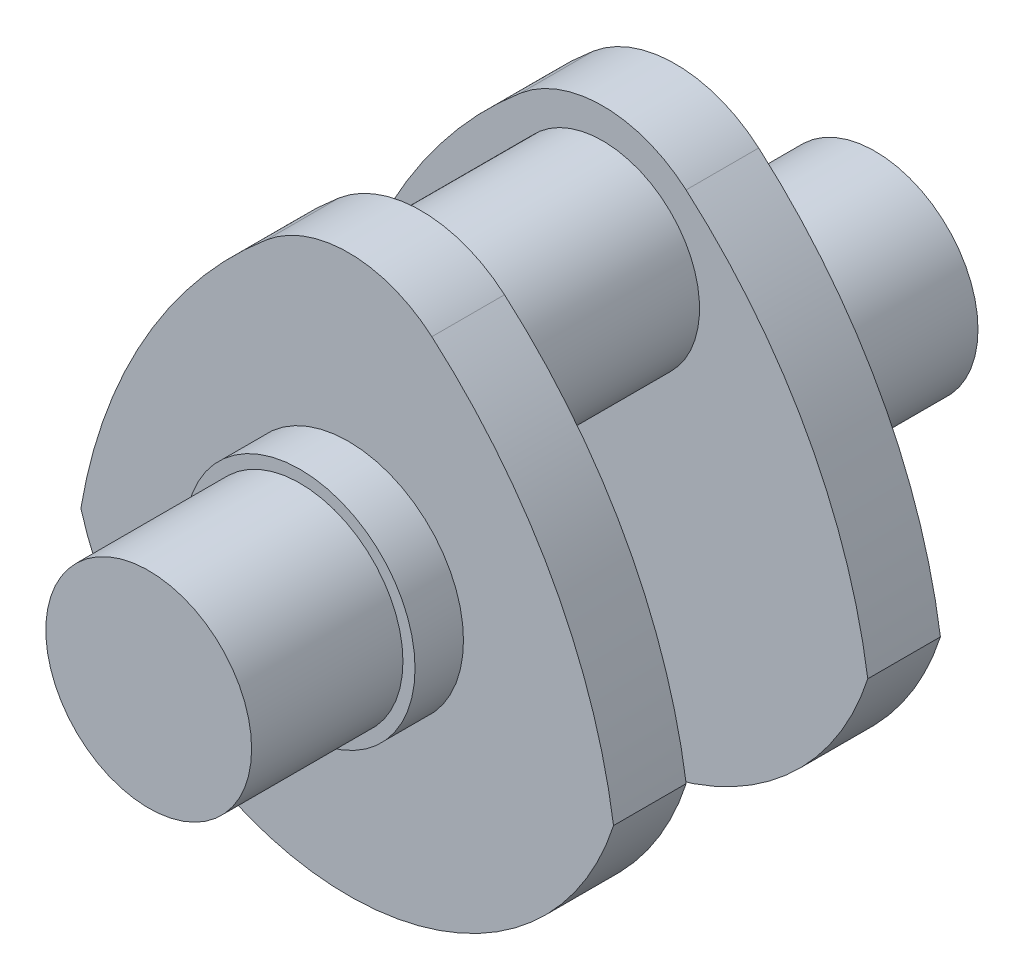
ISO-10303-21;
HEADER;
FILE_DESCRIPTION(('STEP AP214'),'2;1');
FILE_NAME('part.step','',(''),(''),'','','');
FILE_SCHEMA(('AUTOMOTIVE_DESIGN { 1 0 10303 214 1 1 1 1 }'));
ENDSEC;
DATA;
#1=APPLICATION_CONTEXT('core data for automotive mechanical design processes');
#2=APPLICATION_PROTOCOL_DEFINITION('international standard','automotive_design',2000,#1);
#3=PRODUCT_CONTEXT('',#1,'mechanical');
#4=PRODUCT('Part','Part','',(#3));
#5=PRODUCT_RELATED_PRODUCT_CATEGORY('part','',(#4));
#6=PRODUCT_DEFINITION_FORMATION('','',#4);
#7=PRODUCT_DEFINITION_CONTEXT('part definition',#1,'design');
#8=PRODUCT_DEFINITION('design','',#6,#7);
#9=PRODUCT_DEFINITION_SHAPE('','',#8);
#10=(LENGTH_UNIT() NAMED_UNIT(*) SI_UNIT(.MILLI.,.METRE.));
#11=(NAMED_UNIT(*) PLANE_ANGLE_UNIT() SI_UNIT($,.RADIAN.));
#12=(NAMED_UNIT(*) SI_UNIT($,.STERADIAN.) SOLID_ANGLE_UNIT());
#13=UNCERTAINTY_MEASURE_WITH_UNIT(LENGTH_MEASURE(1.E-05),#10,'distance_accuracy_value','');
#14=(GEOMETRIC_REPRESENTATION_CONTEXT(3) GLOBAL_UNCERTAINTY_ASSIGNED_CONTEXT((#13)) GLOBAL_UNIT_ASSIGNED_CONTEXT((#10,
#11,#12)) REPRESENTATION_CONTEXT('',''));
#15=CARTESIAN_POINT('',(0.,0.,0.));
#16=DIRECTION('',(0.,0.,1.));
#17=DIRECTION('',(1.,0.,0.));
#18=AXIS2_PLACEMENT_3D('',#15,#16,#17);
#19=CARTESIAN_POINT('',(0.,0.,25.));
#20=DIRECTION('',(0.,0.,-1.));
#21=DIRECTION('',(-1.,0.,0.));
#22=AXIS2_PLACEMENT_3D('',#19,#20,#21);
#23=CYLINDRICAL_SURFACE('',#22,17.);
#24=CARTESIAN_POINT('',(0.,0.,25.));
#25=DIRECTION('',(0.,0.,1.));
#26=DIRECTION('',(1.,0.,0.));
#27=AXIS2_PLACEMENT_3D('',#24,#25,#26);
#28=CIRCLE('',#27,17.);
#29=CARTESIAN_POINT('',(17.,0.,25.));
#30=VERTEX_POINT('',#29);
#31=EDGE_CURVE('E11',#30,#30,#28,.T.);
#32=ORIENTED_EDGE('',*,*,#31,.F.);
#33=EDGE_LOOP('',(#32));
#34=FACE_BOUND('',#33,.T.);
#35=CARTESIAN_POINT('',(0.,0.,0.));
#36=DIRECTION('',(0.,0.,1.));
#37=DIRECTION('',(1.,0.,0.));
#38=AXIS2_PLACEMENT_3D('',#35,#36,#37);
#39=CIRCLE('',#38,17.);
#40=CARTESIAN_POINT('',(17.,0.,0.));
#41=VERTEX_POINT('',#40);
#42=EDGE_CURVE('E42',#41,#41,#39,.T.);
#43=ORIENTED_EDGE('',*,*,#42,.T.);
#44=EDGE_LOOP('',(#43));
#45=FACE_BOUND('',#44,.T.);
#46=ADVANCED_FACE('F39',(#34,#45),#23,.T.);
#47=CARTESIAN_POINT('',(0.,0.,25.));
#48=DIRECTION('',(0.,0.,1.));
#49=DIRECTION('',(1.,0.,0.));
#50=AXIS2_PLACEMENT_3D('',#47,#48,#49);
#51=PLANE('',#50);
#52=ORIENTED_EDGE('',*,*,#31,.T.);
#53=EDGE_LOOP('',(#52));
#54=FACE_BOUND('',#53,.T.);
#55=ADVANCED_FACE('F216',(#54),#51,.T.);
#56=CARTESIAN_POINT('',(0.,0.,-8.));
#57=DIRECTION('',(0.,0.,1.));
#58=DIRECTION('',(1.,0.,0.));
#59=AXIS2_PLACEMENT_3D('',#56,#57,#58);
#60=CYLINDRICAL_SURFACE('',#59,19.);
#61=CARTESIAN_POINT('',(0.,0.,-8.));
#62=DIRECTION('',(0.,0.,-1.));
#63=DIRECTION('',(-1.,0.,0.));
#64=AXIS2_PLACEMENT_3D('',#61,#62,#63);
#65=CIRCLE('',#64,19.);
#66=CARTESIAN_POINT('',(-19.,0.,-8.));
#67=VERTEX_POINT('',#66);
#68=EDGE_CURVE('E196',#67,#67,#65,.T.);
#69=ORIENTED_EDGE('',*,*,#68,.F.);
#70=EDGE_LOOP('',(#69));
#71=FACE_BOUND('',#70,.T.);
#72=CARTESIAN_POINT('',(0.,0.,0.));
#73=DIRECTION('',(0.,0.,-1.));
#74=DIRECTION('',(-1.,0.,0.));
#75=AXIS2_PLACEMENT_3D('',#72,#73,#74);
#76=CIRCLE('',#75,19.);
#77=CARTESIAN_POINT('',(-19.,0.,0.));
#78=VERTEX_POINT('',#77);
#79=EDGE_CURVE('E195',#78,#78,#76,.T.);
#80=ORIENTED_EDGE('',*,*,#79,.T.);
#81=EDGE_LOOP('',(#80));
#82=FACE_BOUND('',#81,.T.);
#83=ADVANCED_FACE('F202',(#71,#82),#60,.T.);
#84=CARTESIAN_POINT('',(0.,0.,0.));
#85=DIRECTION('',(0.,0.,-1.));
#86=DIRECTION('',(-1.,0.,0.));
#87=AXIS2_PLACEMENT_3D('',#84,#85,#86);
#88=PLANE('',#87);
#89=ORIENTED_EDGE('',*,*,#42,.F.);
#90=EDGE_LOOP('',(#89));
#91=FACE_BOUND('',#90,.T.);
#92=ORIENTED_EDGE('',*,*,#79,.F.);
#93=EDGE_LOOP('',(#92));
#94=FACE_BOUND('',#93,.T.);
#95=ADVANCED_FACE('F204',(#91,#94),#88,.F.);
#96=CARTESIAN_POINT('',(0.,0.,-20.));
#97=DIRECTION('',(0.,0.,1.));
#98=DIRECTION('',(1.,0.,0.));
#99=AXIS2_PLACEMENT_3D('',#96,#97,#98);
#100=CYLINDRICAL_SURFACE('',#99,46.);
#101=CARTESIAN_POINT('',(0.,0.,-8.));
#102=DIRECTION('',(0.,0.,-1.));
#103=DIRECTION('',(-1.,0.,0.));
#104=AXIS2_PLACEMENT_3D('',#101,#102,#103);
#105=CIRCLE('',#104,46.);
#106=CARTESIAN_POINT('',(43.7904289194114,-14.0853943875909,-8.));
#107=VERTEX_POINT('',#106);
#108=CARTESIAN_POINT('',(-44.2095710805886,-12.708808947749,-8.));
#109=VERTEX_POINT('',#108);
#110=EDGE_CURVE('E174',#107,#109,#105,.T.);
#111=ORIENTED_EDGE('',*,*,#110,.T.);
#112=DIRECTION('',(0.,0.,1.));
#113=VECTOR('',#112,1.);
#114=CARTESIAN_POINT('',(-44.2095710805886,-12.708808947749,-20.));
#115=LINE('',#114,#113);
#116=CARTESIAN_POINT('',(-44.2095710805886,-12.708808947749,-20.));
#117=VERTEX_POINT('',#116);
#118=EDGE_CURVE('E193',#117,#109,#115,.T.);
#119=ORIENTED_EDGE('',*,*,#118,.F.);
#120=CARTESIAN_POINT('',(0.,0.,-20.));
#121=DIRECTION('',(0.,0.,-1.));
#122=DIRECTION('',(-1.,0.,0.));
#123=AXIS2_PLACEMENT_3D('',#120,#121,#122);
#124=CIRCLE('',#123,46.);
#125=CARTESIAN_POINT('',(43.7904289194114,-14.0853943875909,-20.));
#126=VERTEX_POINT('',#125);
#127=EDGE_CURVE('E175',#126,#117,#124,.T.);
#128=ORIENTED_EDGE('',*,*,#127,.F.);
#129=DIRECTION('',(0.,0.,1.));
#130=VECTOR('',#129,1.);
#131=CARTESIAN_POINT('',(43.7904289194114,-14.0853943875909,-20.));
#132=LINE('',#131,#130);
#133=EDGE_CURVE('E181',#126,#107,#132,.T.);
#134=ORIENTED_EDGE('',*,*,#133,.T.);
#135=EDGE_LOOP('',(#111,#119,#128,#134));
#136=FACE_BOUND('',#135,.T.);
#137=ADVANCED_FACE('F206',(#136),#100,.T.);
#138=CARTESIAN_POINT('',(44.5321572816859,-27.7056635271693,-20.));
#139=DIRECTION('',(0.,0.,1.));
#140=DIRECTION('',(1.,0.,0.));
#141=AXIS2_PLACEMENT_3D('',#138,#139,#140);
#142=CYLINDRICAL_SURFACE('',#141,90.);
#143=CARTESIAN_POINT('',(44.5321572816859,-27.7056635271693,-8.));
#144=DIRECTION('',(0.,0.,-1.));
#145=DIRECTION('',(1.,0.,0.));
#146=AXIS2_PLACEMENT_3D('',#143,#144,#145);
#147=CIRCLE('',#146,90.);
#148=CARTESIAN_POINT('',(-13.5532652596435,41.0408541169646,-8.));
#149=VERTEX_POINT('',#148);
#150=EDGE_CURVE('E184',#109,#149,#147,.T.);
#151=ORIENTED_EDGE('',*,*,#150,.T.);
#152=DIRECTION('',(0.,0.,1.));
#153=VECTOR('',#152,1.);
#154=CARTESIAN_POINT('',(-13.5532652596435,41.0408541169646,-20.));
#155=LINE('',#154,#153);
#156=CARTESIAN_POINT('',(-13.5532652596435,41.0408541169646,-20.));
#157=VERTEX_POINT('',#156);
#158=EDGE_CURVE('E191',#157,#149,#155,.T.);
#159=ORIENTED_EDGE('',*,*,#158,.F.);
#160=CARTESIAN_POINT('',(44.5321572816859,-27.7056635271693,-20.));
#161=DIRECTION('',(0.,0.,-1.));
#162=DIRECTION('',(1.,0.,0.));
#163=AXIS2_PLACEMENT_3D('',#160,#161,#162);
#164=CIRCLE('',#163,90.);
#165=EDGE_CURVE('E87',#117,#157,#164,.T.);
#166=ORIENTED_EDGE('',*,*,#165,.F.);
#167=ORIENTED_EDGE('',*,*,#118,.T.);
#168=EDGE_LOOP('',(#151,#159,#166,#167));
#169=FACE_BOUND('',#168,.T.);
#170=ADVANCED_FACE('F212',(#169),#142,.T.);
#171=CARTESIAN_POINT('',(0.,25.,-20.));
#172=DIRECTION('',(0.,0.,1.));
#173=DIRECTION('',(1.,0.,0.));
#174=AXIS2_PLACEMENT_3D('',#171,#172,#173);
#175=CYLINDRICAL_SURFACE('',#174,21.);
#176=CARTESIAN_POINT('',(0.,25.,-8.));
#177=DIRECTION('',(0.,0.,-1.));
#178=DIRECTION('',(1.,0.,0.));
#179=AXIS2_PLACEMENT_3D('',#176,#177,#178);
#180=CIRCLE('',#179,21.);
#181=CARTESIAN_POINT('',(13.7769546854011,40.8491488603144,-8.));
#182=VERTEX_POINT('',#181);
#183=EDGE_CURVE('E73',#149,#182,#180,.T.);
#184=ORIENTED_EDGE('',*,*,#183,.T.);
#185=DIRECTION('',(0.,0.,1.));
#186=VECTOR('',#185,1.);
#187=CARTESIAN_POINT('',(13.7769546854011,40.8491488603144,-20.));
#188=LINE('',#187,#186);
#189=CARTESIAN_POINT('',(13.7769546854011,40.8491488603144,-20.));
#190=VERTEX_POINT('',#189);
#191=EDGE_CURVE('E189',#190,#182,#188,.T.);
#192=ORIENTED_EDGE('',*,*,#191,.F.);
#193=CARTESIAN_POINT('',(0.,25.,-20.));
#194=DIRECTION('',(0.,0.,-1.));
#195=DIRECTION('',(1.,0.,0.));
#196=AXIS2_PLACEMENT_3D('',#193,#194,#195);
#197=CIRCLE('',#196,21.);
#198=EDGE_CURVE('E178',#157,#190,#197,.T.);
#199=ORIENTED_EDGE('',*,*,#198,.F.);
#200=ORIENTED_EDGE('',*,*,#158,.T.);
#201=EDGE_LOOP('',(#184,#192,#199,#200));
#202=FACE_BOUND('',#201,.T.);
#203=ADVANCED_FACE('F238',(#202),#175,.T.);
#204=CARTESIAN_POINT('',(-45.2671368234607,-27.0757748267473,-20.));
#205=DIRECTION('',(0.,0.,1.));
#206=DIRECTION('',(1.,0.,0.));
#207=AXIS2_PLACEMENT_3D('',#204,#205,#206);
#208=CYLINDRICAL_SURFACE('',#207,90.);
#209=CARTESIAN_POINT('',(-45.2671368234607,-27.0757748267473,-8.));
#210=DIRECTION('',(0.,0.,-1.));
#211=DIRECTION('',(1.,0.,0.));
#212=AXIS2_PLACEMENT_3D('',#209,#210,#211);
#213=CIRCLE('',#212,90.);
#214=EDGE_CURVE('E79',#182,#107,#213,.T.);
#215=ORIENTED_EDGE('',*,*,#214,.T.);
#216=ORIENTED_EDGE('',*,*,#133,.F.);
#217=CARTESIAN_POINT('',(-45.2671368234607,-27.0757748267473,-20.));
#218=DIRECTION('',(0.,0.,-1.));
#219=DIRECTION('',(1.,0.,0.));
#220=AXIS2_PLACEMENT_3D('',#217,#218,#219);
#221=CIRCLE('',#220,90.);
#222=EDGE_CURVE('E55',#190,#126,#221,.T.);
#223=ORIENTED_EDGE('',*,*,#222,.F.);
#224=ORIENTED_EDGE('',*,*,#191,.T.);
#225=EDGE_LOOP('',(#215,#216,#223,#224));
#226=FACE_BOUND('',#225,.T.);
#227=ADVANCED_FACE('F246',(#226),#208,.T.);
#228=CARTESIAN_POINT('',(22.266078640843,-13.8528317635847,-20.));
#229=DIRECTION('',(0.,0.,-1.));
#230=DIRECTION('',(-1.,0.,0.));
#231=AXIS2_PLACEMENT_3D('',#228,#229,#230);
#232=PLANE('',#231);
#233=CARTESIAN_POINT('',(0.,25.,-20.));
#234=DIRECTION('',(0.,0.,-1.));
#235=DIRECTION('',(-1.,0.,0.));
#236=AXIS2_PLACEMENT_3D('',#233,#234,#235);
#237=CIRCLE('',#236,16.);
#238=CARTESIAN_POINT('',(-16.,25.,-20.));
#239=VERTEX_POINT('',#238);
#240=EDGE_CURVE('E169',#239,#239,#237,.T.);
#241=ORIENTED_EDGE('',*,*,#240,.F.);
#242=EDGE_LOOP('',(#241));
#243=FACE_BOUND('',#242,.T.);
#244=ORIENTED_EDGE('',*,*,#127,.T.);
#245=ORIENTED_EDGE('',*,*,#165,.T.);
#246=ORIENTED_EDGE('',*,*,#198,.T.);
#247=ORIENTED_EDGE('',*,*,#222,.T.);
#248=EDGE_LOOP('',(#244,#245,#246,#247));
#249=FACE_BOUND('',#248,.T.);
#250=ADVANCED_FACE('F254',(#243,#249),#232,.T.);
#251=CARTESIAN_POINT('',(22.266078640843,-13.8528317635847,-8.));
#252=DIRECTION('',(0.,0.,-1.));
#253=DIRECTION('',(-1.,0.,0.));
#254=AXIS2_PLACEMENT_3D('',#251,#252,#253);
#255=PLANE('',#254);
#256=ORIENTED_EDGE('',*,*,#68,.T.);
#257=EDGE_LOOP('',(#256));
#258=FACE_BOUND('',#257,.T.);
#259=ORIENTED_EDGE('',*,*,#110,.F.);
#260=ORIENTED_EDGE('',*,*,#214,.F.);
#261=ORIENTED_EDGE('',*,*,#183,.F.);
#262=ORIENTED_EDGE('',*,*,#150,.F.);
#263=EDGE_LOOP('',(#259,#260,#261,#262));
#264=FACE_BOUND('',#263,.T.);
#265=ADVANCED_FACE('F260',(#258,#264),#255,.F.);
#266=CARTESIAN_POINT('',(0.,25.,-35.));
#267=DIRECTION('',(0.,0.,1.));
#268=DIRECTION('',(1.,0.,0.));
#269=AXIS2_PLACEMENT_3D('',#266,#267,#268);
#270=CYLINDRICAL_SURFACE('',#269,16.);
#271=ORIENTED_EDGE('',*,*,#240,.T.);
#272=EDGE_LOOP('',(#271));
#273=FACE_BOUND('',#272,.T.);
#274=CARTESIAN_POINT('',(0.,25.,-50.));
#275=DIRECTION('',(0.,0.,-1.));
#276=DIRECTION('',(-1.,0.,0.));
#277=AXIS2_PLACEMENT_3D('',#274,#275,#276);
#278=CIRCLE('',#277,16.);
#279=CARTESIAN_POINT('',(-16.,25.,-50.));
#280=VERTEX_POINT('',#279);
#281=EDGE_CURVE('E145',#280,#280,#278,.T.);
#282=ORIENTED_EDGE('',*,*,#281,.F.);
#283=EDGE_LOOP('',(#282));
#284=FACE_BOUND('',#283,.T.);
#285=ADVANCED_FACE('F263',(#273,#284),#270,.T.);
#286=CARTESIAN_POINT('',(0.,0.,-95.));
#287=DIRECTION('',(0.,0.,1.));
#288=DIRECTION('',(-1.,0.,0.));
#289=AXIS2_PLACEMENT_3D('',#286,#287,#288);
#290=CYLINDRICAL_SURFACE('',#289,17.);
#291=CARTESIAN_POINT('',(0.,0.,-95.));
#292=DIRECTION('',(0.,0.,1.));
#293=DIRECTION('',(1.,0.,0.));
#294=AXIS2_PLACEMENT_3D('',#291,#292,#293);
#295=CIRCLE('',#294,17.);
#296=CARTESIAN_POINT('',(17.,0.,-95.));
#297=VERTEX_POINT('',#296);
#298=EDGE_CURVE('E166',#297,#297,#295,.T.);
#299=ORIENTED_EDGE('',*,*,#298,.T.);
#300=EDGE_LOOP('',(#299));
#301=FACE_BOUND('',#300,.T.);
#302=CARTESIAN_POINT('',(0.,0.,-70.));
#303=DIRECTION('',(0.,0.,1.));
#304=DIRECTION('',(1.,0.,0.));
#305=AXIS2_PLACEMENT_3D('',#302,#303,#304);
#306=CIRCLE('',#305,17.);
#307=CARTESIAN_POINT('',(17.,0.,-70.));
#308=VERTEX_POINT('',#307);
#309=EDGE_CURVE('E163',#308,#308,#306,.T.);
#310=ORIENTED_EDGE('',*,*,#309,.F.);
#311=EDGE_LOOP('',(#310));
#312=FACE_BOUND('',#311,.T.);
#313=ADVANCED_FACE('F282',(#301,#312),#290,.T.);
#314=CARTESIAN_POINT('',(0.,0.,-95.));
#315=DIRECTION('',(0.,0.,-1.));
#316=DIRECTION('',(1.,0.,0.));
#317=AXIS2_PLACEMENT_3D('',#314,#315,#316);
#318=PLANE('',#317);
#319=ORIENTED_EDGE('',*,*,#298,.F.);
#320=EDGE_LOOP('',(#319));
#321=FACE_BOUND('',#320,.T.);
#322=ADVANCED_FACE('F293',(#321),#318,.T.);
#323=CARTESIAN_POINT('',(0.,0.,-62.));
#324=DIRECTION('',(0.,0.,-1.));
#325=DIRECTION('',(1.,0.,0.));
#326=AXIS2_PLACEMENT_3D('',#323,#324,#325);
#327=CYLINDRICAL_SURFACE('',#326,19.);
#328=CARTESIAN_POINT('',(0.,0.,-62.));
#329=DIRECTION('',(0.,0.,-1.));
#330=DIRECTION('',(-1.,0.,0.));
#331=AXIS2_PLACEMENT_3D('',#328,#329,#330);
#332=CIRCLE('',#331,19.);
#333=CARTESIAN_POINT('',(-19.,0.,-62.));
#334=VERTEX_POINT('',#333);
#335=EDGE_CURVE('E160',#334,#334,#332,.T.);
#336=ORIENTED_EDGE('',*,*,#335,.T.);
#337=EDGE_LOOP('',(#336));
#338=FACE_BOUND('',#337,.T.);
#339=CARTESIAN_POINT('',(0.,0.,-70.));
#340=DIRECTION('',(0.,0.,-1.));
#341=DIRECTION('',(-1.,0.,0.));
#342=AXIS2_PLACEMENT_3D('',#339,#340,#341);
#343=CIRCLE('',#342,19.);
#344=CARTESIAN_POINT('',(-19.,0.,-70.));
#345=VERTEX_POINT('',#344);
#346=EDGE_CURVE('E134',#345,#345,#343,.T.);
#347=ORIENTED_EDGE('',*,*,#346,.F.);
#348=EDGE_LOOP('',(#347));
#349=FACE_BOUND('',#348,.T.);
#350=ADVANCED_FACE('F302',(#338,#349),#327,.T.);
#351=CARTESIAN_POINT('',(0.,0.,-70.));
#352=DIRECTION('',(0.,0.,1.));
#353=DIRECTION('',(-1.,0.,0.));
#354=AXIS2_PLACEMENT_3D('',#351,#352,#353);
#355=PLANE('',#354);
#356=ORIENTED_EDGE('',*,*,#309,.T.);
#357=EDGE_LOOP('',(#356));
#358=FACE_BOUND('',#357,.T.);
#359=ORIENTED_EDGE('',*,*,#346,.T.);
#360=EDGE_LOOP('',(#359));
#361=FACE_BOUND('',#360,.T.);
#362=ADVANCED_FACE('F311',(#358,#361),#355,.F.);
#363=CARTESIAN_POINT('',(0.,0.,-50.));
#364=DIRECTION('',(0.,0.,-1.));
#365=DIRECTION('',(1.,0.,0.));
#366=AXIS2_PLACEMENT_3D('',#363,#364,#365);
#367=CYLINDRICAL_SURFACE('',#366,46.);
#368=CARTESIAN_POINT('',(0.,0.,-62.));
#369=DIRECTION('',(0.,0.,-1.));
#370=DIRECTION('',(-1.,0.,0.));
#371=AXIS2_PLACEMENT_3D('',#368,#369,#370);
#372=CIRCLE('',#371,46.);
#373=CARTESIAN_POINT('',(43.7904289194114,-14.0853943875909,-62.));
#374=VERTEX_POINT('',#373);
#375=CARTESIAN_POINT('',(-44.2095710805886,-12.708808947749,-62.));
#376=VERTEX_POINT('',#375);
#377=EDGE_CURVE('E150',#374,#376,#372,.T.);
#378=ORIENTED_EDGE('',*,*,#377,.F.);
#379=DIRECTION('',(0.,0.,-1.));
#380=VECTOR('',#379,1.);
#381=CARTESIAN_POINT('',(43.7904289194114,-14.0853943875909,-50.));
#382=LINE('',#381,#380);
#383=CARTESIAN_POINT('',(43.7904289194114,-14.0853943875909,-50.));
#384=VERTEX_POINT('',#383);
#385=EDGE_CURVE('E139',#384,#374,#382,.T.);
#386=ORIENTED_EDGE('',*,*,#385,.F.);
#387=CARTESIAN_POINT('',(0.,0.,-50.));
#388=DIRECTION('',(0.,0.,-1.));
#389=DIRECTION('',(-1.,0.,0.));
#390=AXIS2_PLACEMENT_3D('',#387,#388,#389);
#391=CIRCLE('',#390,46.);
#392=CARTESIAN_POINT('',(-44.2095710805886,-12.708808947749,-50.));
#393=VERTEX_POINT('',#392);
#394=EDGE_CURVE('E118',#384,#393,#391,.T.);
#395=ORIENTED_EDGE('',*,*,#394,.T.);
#396=DIRECTION('',(0.,0.,-1.));
#397=VECTOR('',#396,1.);
#398=CARTESIAN_POINT('',(-44.2095710805886,-12.708808947749,-50.));
#399=LINE('',#398,#397);
#400=EDGE_CURVE('E127',#393,#376,#399,.T.);
#401=ORIENTED_EDGE('',*,*,#400,.T.);
#402=EDGE_LOOP('',(#378,#386,#395,#401));
#403=FACE_BOUND('',#402,.T.);
#404=ADVANCED_FACE('F137',(#403),#367,.T.);
#405=CARTESIAN_POINT('',(44.5321572816859,-27.7056635271693,-50.));
#406=DIRECTION('',(0.,0.,-1.));
#407=DIRECTION('',(1.,0.,0.));
#408=AXIS2_PLACEMENT_3D('',#405,#406,#407);
#409=CYLINDRICAL_SURFACE('',#408,90.);
#410=CARTESIAN_POINT('',(44.5321572816859,-27.7056635271693,-62.));
#411=DIRECTION('',(0.,0.,-1.));
#412=DIRECTION('',(1.,0.,0.));
#413=AXIS2_PLACEMENT_3D('',#410,#411,#412);
#414=CIRCLE('',#413,90.);
#415=CARTESIAN_POINT('',(-13.5532652596435,41.0408541169646,-62.));
#416=VERTEX_POINT('',#415);
#417=EDGE_CURVE('E130',#376,#416,#414,.T.);
#418=ORIENTED_EDGE('',*,*,#417,.F.);
#419=ORIENTED_EDGE('',*,*,#400,.F.);
#420=CARTESIAN_POINT('',(44.5321572816859,-27.7056635271693,-50.));
#421=DIRECTION('',(0.,0.,-1.));
#422=DIRECTION('',(1.,0.,0.));
#423=AXIS2_PLACEMENT_3D('',#420,#421,#422);
#424=CIRCLE('',#423,90.);
#425=CARTESIAN_POINT('',(-13.5532652596435,41.0408541169646,-50.));
#426=VERTEX_POINT('',#425);
#427=EDGE_CURVE('E114',#393,#426,#424,.T.);
#428=ORIENTED_EDGE('',*,*,#427,.T.);
#429=DIRECTION('',(0.,0.,-1.));
#430=VECTOR('',#429,1.);
#431=CARTESIAN_POINT('',(-13.5532652596435,41.0408541169646,-50.));
#432=LINE('',#431,#430);
#433=EDGE_CURVE('E135',#426,#416,#432,.T.);
#434=ORIENTED_EDGE('',*,*,#433,.T.);
#435=EDGE_LOOP('',(#418,#419,#428,#434));
#436=FACE_BOUND('',#435,.T.);
#437=ADVANCED_FACE('F128',(#436),#409,.T.);
#438=CARTESIAN_POINT('',(0.,25.,-50.));
#439=DIRECTION('',(0.,0.,-1.));
#440=DIRECTION('',(1.,0.,0.));
#441=AXIS2_PLACEMENT_3D('',#438,#439,#440);
#442=CYLINDRICAL_SURFACE('',#441,21.);
#443=CARTESIAN_POINT('',(0.,25.,-62.));
#444=DIRECTION('',(0.,0.,-1.));
#445=DIRECTION('',(1.,0.,0.));
#446=AXIS2_PLACEMENT_3D('',#443,#444,#445);
#447=CIRCLE('',#446,21.);
#448=CARTESIAN_POINT('',(13.7769546854011,40.8491488603144,-62.));
#449=VERTEX_POINT('',#448);
#450=EDGE_CURVE('E142',#416,#449,#447,.T.);
#451=ORIENTED_EDGE('',*,*,#450,.F.);
#452=ORIENTED_EDGE('',*,*,#433,.F.);
#453=CARTESIAN_POINT('',(0.,25.,-50.));
#454=DIRECTION('',(0.,0.,-1.));
#455=DIRECTION('',(1.,0.,0.));
#456=AXIS2_PLACEMENT_3D('',#453,#454,#455);
#457=CIRCLE('',#456,21.);
#458=CARTESIAN_POINT('',(13.7769546854011,40.8491488603144,-50.));
#459=VERTEX_POINT('',#458);
#460=EDGE_CURVE('E121',#426,#459,#457,.T.);
#461=ORIENTED_EDGE('',*,*,#460,.T.);
#462=DIRECTION('',(0.,0.,-1.));
#463=VECTOR('',#462,1.);
#464=CARTESIAN_POINT('',(13.7769546854011,40.8491488603144,-50.));
#465=LINE('',#464,#463);
#466=EDGE_CURVE('E156',#459,#449,#465,.T.);
#467=ORIENTED_EDGE('',*,*,#466,.T.);
#468=EDGE_LOOP('',(#451,#452,#461,#467));
#469=FACE_BOUND('',#468,.T.);
#470=ADVANCED_FACE('F335',(#469),#442,.T.);
#471=CARTESIAN_POINT('',(-45.2671368234607,-27.0757748267473,-50.));
#472=DIRECTION('',(0.,0.,-1.));
#473=DIRECTION('',(1.,0.,0.));
#474=AXIS2_PLACEMENT_3D('',#471,#472,#473);
#475=CYLINDRICAL_SURFACE('',#474,90.);
#476=CARTESIAN_POINT('',(-45.2671368234607,-27.0757748267473,-62.));
#477=DIRECTION('',(0.,0.,-1.));
#478=DIRECTION('',(1.,0.,0.));
#479=AXIS2_PLACEMENT_3D('',#476,#477,#478);
#480=CIRCLE('',#479,90.);
#481=EDGE_CURVE('E140',#449,#374,#480,.T.);
#482=ORIENTED_EDGE('',*,*,#481,.F.);
#483=ORIENTED_EDGE('',*,*,#466,.F.);
#484=CARTESIAN_POINT('',(-45.2671368234607,-27.0757748267473,-50.));
#485=DIRECTION('',(0.,0.,-1.));
#486=DIRECTION('',(1.,0.,0.));
#487=AXIS2_PLACEMENT_3D('',#484,#485,#486);
#488=CIRCLE('',#487,90.);
#489=EDGE_CURVE('E148',#459,#384,#488,.T.);
#490=ORIENTED_EDGE('',*,*,#489,.T.);
#491=ORIENTED_EDGE('',*,*,#385,.T.);
#492=EDGE_LOOP('',(#482,#483,#490,#491));
#493=FACE_BOUND('',#492,.T.);
#494=ADVANCED_FACE('F343',(#493),#475,.T.);
#495=CARTESIAN_POINT('',(22.266078640843,-13.8528317635847,-50.));
#496=DIRECTION('',(0.,0.,1.));
#497=DIRECTION('',(-1.,0.,0.));
#498=AXIS2_PLACEMENT_3D('',#495,#496,#497);
#499=PLANE('',#498);
#500=ORIENTED_EDGE('',*,*,#281,.T.);
#501=EDGE_LOOP('',(#500));
#502=FACE_BOUND('',#501,.T.);
#503=ORIENTED_EDGE('',*,*,#394,.F.);
#504=ORIENTED_EDGE('',*,*,#489,.F.);
#505=ORIENTED_EDGE('',*,*,#460,.F.);
#506=ORIENTED_EDGE('',*,*,#427,.F.);
#507=EDGE_LOOP('',(#503,#504,#505,#506));
#508=FACE_BOUND('',#507,.T.);
#509=ADVANCED_FACE('F116',(#502,#508),#499,.T.);
#510=CARTESIAN_POINT('',(22.266078640843,-13.8528317635847,-62.));
#511=DIRECTION('',(0.,0.,1.));
#512=DIRECTION('',(-1.,0.,0.));
#513=AXIS2_PLACEMENT_3D('',#510,#511,#512);
#514=PLANE('',#513);
#515=ORIENTED_EDGE('',*,*,#335,.F.);
#516=EDGE_LOOP('',(#515));
#517=FACE_BOUND('',#516,.T.);
#518=ORIENTED_EDGE('',*,*,#377,.T.);
#519=ORIENTED_EDGE('',*,*,#417,.T.);
#520=ORIENTED_EDGE('',*,*,#450,.T.);
#521=ORIENTED_EDGE('',*,*,#481,.T.);
#522=EDGE_LOOP('',(#518,#519,#520,#521));
#523=FACE_BOUND('',#522,.T.);
#524=ADVANCED_FACE('F360',(#517,#523),#514,.F.);
#525=CLOSED_SHELL('',(#46,#55,#83,#95,#137,#170,#203,#227,#250,#265,#285,#313,#322,#350,#362,
#404,#437,#470,#494,#509,#524));
#526=MANIFOLD_SOLID_BREP('B2',#525);
#527=ADVANCED_BREP_SHAPE_REPRESENTATION('',(#18,#526),#14);
#528=SHAPE_DEFINITION_REPRESENTATION(#9,#527);
ENDSEC;
END-ISO-10303-21;
